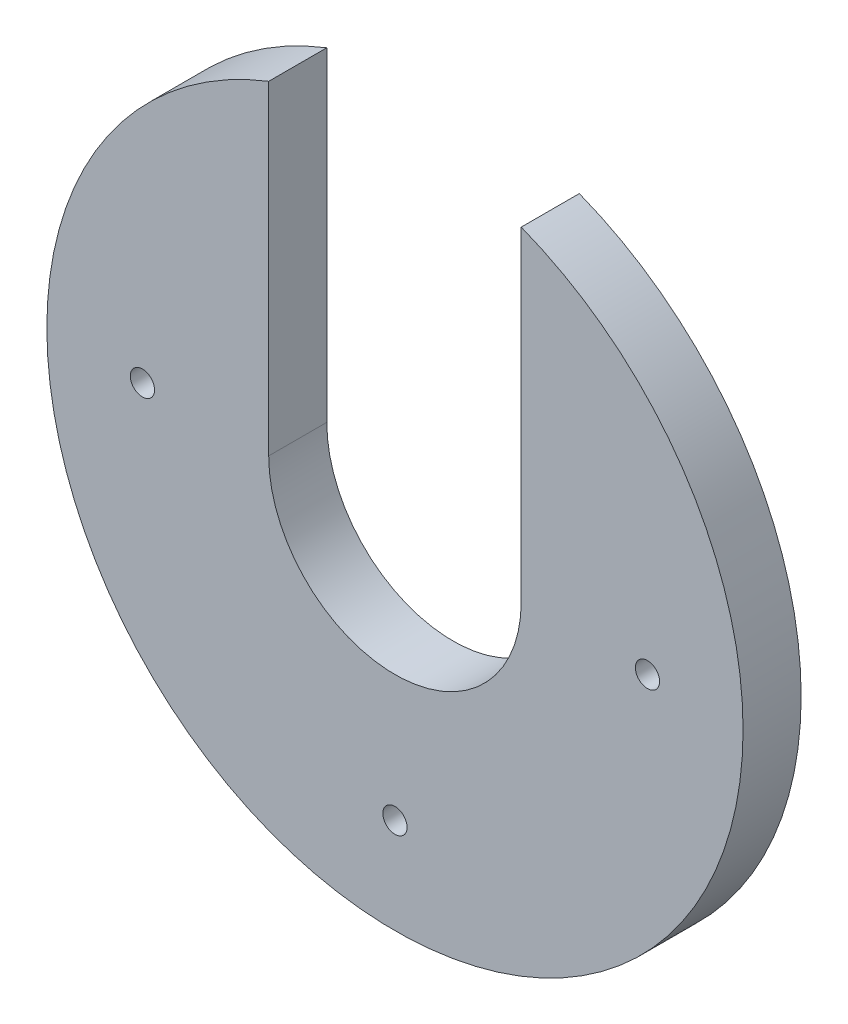
ISO-10303-21;
HEADER;
FILE_DESCRIPTION(('STEP AP214'),'2;1');
FILE_NAME('part.step','',(''),(''),'','','');
FILE_SCHEMA(('AUTOMOTIVE_DESIGN { 1 0 10303 214 1 1 1 1 }'));
ENDSEC;
DATA;
#1=APPLICATION_CONTEXT('core data for automotive mechanical design processes');
#2=APPLICATION_PROTOCOL_DEFINITION('international standard','automotive_design',2000,#1);
#3=PRODUCT_CONTEXT('',#1,'mechanical');
#4=PRODUCT('Part','Part','',(#3));
#5=PRODUCT_RELATED_PRODUCT_CATEGORY('part','',(#4));
#6=PRODUCT_DEFINITION_FORMATION('','',#4);
#7=PRODUCT_DEFINITION_CONTEXT('part definition',#1,'design');
#8=PRODUCT_DEFINITION('design','',#6,#7);
#9=PRODUCT_DEFINITION_SHAPE('','',#8);
#10=(LENGTH_UNIT() NAMED_UNIT(*) SI_UNIT(.MILLI.,.METRE.));
#11=(NAMED_UNIT(*) PLANE_ANGLE_UNIT() SI_UNIT($,.RADIAN.));
#12=(NAMED_UNIT(*) SI_UNIT($,.STERADIAN.) SOLID_ANGLE_UNIT());
#13=UNCERTAINTY_MEASURE_WITH_UNIT(LENGTH_MEASURE(1.E-05),#10,'distance_accuracy_value','');
#14=(GEOMETRIC_REPRESENTATION_CONTEXT(3) GLOBAL_UNCERTAINTY_ASSIGNED_CONTEXT((#13)) GLOBAL_UNIT_ASSIGNED_CONTEXT((#10,
#11,#12)) REPRESENTATION_CONTEXT('',''));
#15=CARTESIAN_POINT('',(0.,0.,0.));
#16=DIRECTION('',(0.,0.,1.));
#17=DIRECTION('',(1.,0.,0.));
#18=AXIS2_PLACEMENT_3D('',#15,#16,#17);
#19=CARTESIAN_POINT('',(0.,0.,5.842));
#20=DIRECTION('',(0.,0.,-1.));
#21=DIRECTION('',(-1.,0.,0.));
#22=AXIS2_PLACEMENT_3D('',#19,#20,#21);
#23=CYLINDRICAL_SURFACE('',#22,12.7);
#24=CARTESIAN_POINT('',(0.,0.,0.));
#25=DIRECTION('',(0.,0.,1.));
#26=DIRECTION('',(1.,0.,0.));
#27=AXIS2_PLACEMENT_3D('',#24,#25,#26);
#28=CIRCLE('',#27,12.7);
#29=CARTESIAN_POINT('',(-12.7,0.,0.));
#30=VERTEX_POINT('',#29);
#31=CARTESIAN_POINT('',(12.7,0.,0.));
#32=VERTEX_POINT('',#31);
#33=EDGE_CURVE('E105',#30,#32,#28,.T.);
#34=ORIENTED_EDGE('',*,*,#33,.F.);
#35=DIRECTION('',(0.,0.,-1.));
#36=VECTOR('',#35,1.);
#37=CARTESIAN_POINT('',(-12.7,0.,5.842));
#38=LINE('',#37,#36);
#39=CARTESIAN_POINT('',(-12.7,0.,5.842));
#40=VERTEX_POINT('',#39);
#41=EDGE_CURVE('E11',#40,#30,#38,.T.);
#42=ORIENTED_EDGE('',*,*,#41,.F.);
#43=CARTESIAN_POINT('',(0.,0.,5.842));
#44=DIRECTION('',(0.,0.,1.));
#45=DIRECTION('',(1.,0.,0.));
#46=AXIS2_PLACEMENT_3D('',#43,#44,#45);
#47=CIRCLE('',#46,12.7);
#48=CARTESIAN_POINT('',(12.7,0.,5.842));
#49=VERTEX_POINT('',#48);
#50=EDGE_CURVE('E89',#40,#49,#47,.T.);
#51=ORIENTED_EDGE('',*,*,#50,.T.);
#52=DIRECTION('',(0.,0.,-1.));
#53=VECTOR('',#52,1.);
#54=CARTESIAN_POINT('',(12.7,0.,5.842));
#55=LINE('',#54,#53);
#56=EDGE_CURVE('E51',#49,#32,#55,.T.);
#57=ORIENTED_EDGE('',*,*,#56,.T.);
#58=EDGE_LOOP('',(#34,#42,#51,#57));
#59=FACE_BOUND('',#58,.T.);
#60=ADVANCED_FACE('F34',(#59),#23,.F.);
#61=CARTESIAN_POINT('',(-12.7,0.,5.842));
#62=DIRECTION('',(-1.,0.,0.));
#63=DIRECTION('',(0.,0.,1.));
#64=AXIS2_PLACEMENT_3D('',#61,#62,#63);
#65=PLANE('',#64);
#66=DIRECTION('',(0.,1.,0.));
#67=VECTOR('',#66,1.);
#68=CARTESIAN_POINT('',(-12.7,0.,0.));
#69=LINE('',#68,#67);
#70=CARTESIAN_POINT('',(-12.7,32.6294834959121,0.));
#71=VERTEX_POINT('',#70);
#72=EDGE_CURVE('E94',#30,#71,#69,.T.);
#73=ORIENTED_EDGE('',*,*,#72,.T.);
#74=DIRECTION('',(0.,0.,-1.));
#75=VECTOR('',#74,1.);
#76=CARTESIAN_POINT('',(-12.7,32.6294834959121,5.842));
#77=LINE('',#76,#75);
#78=CARTESIAN_POINT('',(-12.7,32.6294834959121,5.842));
#79=VERTEX_POINT('',#78);
#80=EDGE_CURVE('E43',#79,#71,#77,.T.);
#81=ORIENTED_EDGE('',*,*,#80,.F.);
#82=DIRECTION('',(0.,1.,0.));
#83=VECTOR('',#82,1.);
#84=CARTESIAN_POINT('',(-12.7,0.,5.842));
#85=LINE('',#84,#83);
#86=EDGE_CURVE('E85',#40,#79,#85,.T.);
#87=ORIENTED_EDGE('',*,*,#86,.F.);
#88=ORIENTED_EDGE('',*,*,#41,.T.);
#89=EDGE_LOOP('',(#73,#81,#87,#88));
#90=FACE_BOUND('',#89,.T.);
#91=ADVANCED_FACE('F92',(#90),#65,.F.);
#92=CARTESIAN_POINT('',(0.,0.,5.842));
#93=DIRECTION('',(0.,0.,-1.));
#94=DIRECTION('',(-1.,0.,0.));
#95=AXIS2_PLACEMENT_3D('',#92,#93,#94);
#96=CYLINDRICAL_SURFACE('',#95,35.0139);
#97=CARTESIAN_POINT('',(0.,0.,0.));
#98=DIRECTION('',(0.,0.,1.));
#99=DIRECTION('',(1.,0.,0.));
#100=AXIS2_PLACEMENT_3D('',#97,#98,#99);
#101=CIRCLE('',#100,35.0139);
#102=CARTESIAN_POINT('',(12.7,32.6294834959121,0.));
#103=VERTEX_POINT('',#102);
#104=EDGE_CURVE('E102',#71,#103,#101,.T.);
#105=ORIENTED_EDGE('',*,*,#104,.T.);
#106=DIRECTION('',(0.,0.,-1.));
#107=VECTOR('',#106,1.);
#108=CARTESIAN_POINT('',(12.7,32.6294834959121,5.842));
#109=LINE('',#108,#107);
#110=CARTESIAN_POINT('',(12.7,32.6294834959121,5.842));
#111=VERTEX_POINT('',#110);
#112=EDGE_CURVE('E65',#111,#103,#109,.T.);
#113=ORIENTED_EDGE('',*,*,#112,.F.);
#114=CARTESIAN_POINT('',(0.,0.,5.842));
#115=DIRECTION('',(0.,0.,1.));
#116=DIRECTION('',(1.,0.,0.));
#117=AXIS2_PLACEMENT_3D('',#114,#115,#116);
#118=CIRCLE('',#117,35.0139);
#119=EDGE_CURVE('E77',#79,#111,#118,.T.);
#120=ORIENTED_EDGE('',*,*,#119,.F.);
#121=ORIENTED_EDGE('',*,*,#80,.T.);
#122=EDGE_LOOP('',(#105,#113,#120,#121));
#123=FACE_BOUND('',#122,.T.);
#124=ADVANCED_FACE('F79',(#123),#96,.T.);
#125=CARTESIAN_POINT('',(25.4,0.,5.842));
#126=DIRECTION('',(0.,0.,-1.));
#127=DIRECTION('',(-1.,0.,0.));
#128=AXIS2_PLACEMENT_3D('',#125,#126,#127);
#129=CYLINDRICAL_SURFACE('',#128,1.2192);
#130=CARTESIAN_POINT('',(25.4,0.,5.842));
#131=DIRECTION('',(0.,0.,1.));
#132=DIRECTION('',(1.,0.,0.));
#133=AXIS2_PLACEMENT_3D('',#130,#131,#132);
#134=CIRCLE('',#133,1.2192);
#135=CARTESIAN_POINT('',(26.6192,0.,5.842));
#136=VERTEX_POINT('',#135);
#137=EDGE_CURVE('E118',#136,#136,#134,.T.);
#138=ORIENTED_EDGE('',*,*,#137,.T.);
#139=EDGE_LOOP('',(#138));
#140=FACE_BOUND('',#139,.T.);
#141=CARTESIAN_POINT('',(25.4,0.,0.));
#142=DIRECTION('',(0.,0.,1.));
#143=DIRECTION('',(1.,0.,0.));
#144=AXIS2_PLACEMENT_3D('',#141,#142,#143);
#145=CIRCLE('',#144,1.2192);
#146=CARTESIAN_POINT('',(26.6192,0.,0.));
#147=VERTEX_POINT('',#146);
#148=EDGE_CURVE('E107',#147,#147,#145,.T.);
#149=ORIENTED_EDGE('',*,*,#148,.F.);
#150=EDGE_LOOP('',(#149));
#151=FACE_BOUND('',#150,.T.);
#152=ADVANCED_FACE('F138',(#140,#151),#129,.F.);
#153=CARTESIAN_POINT('',(0.,-25.4,5.842));
#154=DIRECTION('',(0.,0.,-1.));
#155=DIRECTION('',(-1.,0.,0.));
#156=AXIS2_PLACEMENT_3D('',#153,#154,#155);
#157=CYLINDRICAL_SURFACE('',#156,1.2192);
#158=CARTESIAN_POINT('',(0.,-25.4,5.842));
#159=DIRECTION('',(0.,0.,1.));
#160=DIRECTION('',(1.,0.,0.));
#161=AXIS2_PLACEMENT_3D('',#158,#159,#160);
#162=CIRCLE('',#161,1.2192);
#163=CARTESIAN_POINT('',(1.2192,-25.4,5.842));
#164=VERTEX_POINT('',#163);
#165=EDGE_CURVE('E121',#164,#164,#162,.T.);
#166=ORIENTED_EDGE('',*,*,#165,.T.);
#167=EDGE_LOOP('',(#166));
#168=FACE_BOUND('',#167,.T.);
#169=CARTESIAN_POINT('',(0.,-25.4,0.));
#170=DIRECTION('',(0.,0.,1.));
#171=DIRECTION('',(1.,0.,0.));
#172=AXIS2_PLACEMENT_3D('',#169,#170,#171);
#173=CIRCLE('',#172,1.2192);
#174=CARTESIAN_POINT('',(1.2192,-25.4,0.));
#175=VERTEX_POINT('',#174);
#176=EDGE_CURVE('E110',#175,#175,#173,.T.);
#177=ORIENTED_EDGE('',*,*,#176,.F.);
#178=EDGE_LOOP('',(#177));
#179=FACE_BOUND('',#178,.T.);
#180=ADVANCED_FACE('F141',(#168,#179),#157,.F.);
#181=CARTESIAN_POINT('',(-25.4,0.,5.842));
#182=DIRECTION('',(0.,0.,-1.));
#183=DIRECTION('',(-1.,0.,0.));
#184=AXIS2_PLACEMENT_3D('',#181,#182,#183);
#185=CYLINDRICAL_SURFACE('',#184,1.2192);
#186=CARTESIAN_POINT('',(-25.4,0.,5.842));
#187=DIRECTION('',(0.,0.,1.));
#188=DIRECTION('',(1.,0.,0.));
#189=AXIS2_PLACEMENT_3D('',#186,#187,#188);
#190=CIRCLE('',#189,1.2192);
#191=CARTESIAN_POINT('',(-24.1808,0.,5.842));
#192=VERTEX_POINT('',#191);
#193=EDGE_CURVE('E101',#192,#192,#190,.T.);
#194=ORIENTED_EDGE('',*,*,#193,.T.);
#195=EDGE_LOOP('',(#194));
#196=FACE_BOUND('',#195,.T.);
#197=CARTESIAN_POINT('',(-25.4,0.,0.));
#198=DIRECTION('',(0.,0.,1.));
#199=DIRECTION('',(1.,0.,0.));
#200=AXIS2_PLACEMENT_3D('',#197,#198,#199);
#201=CIRCLE('',#200,1.2192);
#202=CARTESIAN_POINT('',(-24.1808,0.,0.));
#203=VERTEX_POINT('',#202);
#204=EDGE_CURVE('E113',#203,#203,#201,.T.);
#205=ORIENTED_EDGE('',*,*,#204,.F.);
#206=EDGE_LOOP('',(#205));
#207=FACE_BOUND('',#206,.T.);
#208=ADVANCED_FACE('F36',(#196,#207),#185,.F.);
#209=CARTESIAN_POINT('',(12.7,0.,5.842));
#210=DIRECTION('',(-1.,0.,0.));
#211=DIRECTION('',(0.,0.,1.));
#212=AXIS2_PLACEMENT_3D('',#209,#210,#211);
#213=PLANE('',#212);
#214=DIRECTION('',(0.,1.,0.));
#215=VECTOR('',#214,1.);
#216=CARTESIAN_POINT('',(12.7,0.,0.));
#217=LINE('',#216,#215);
#218=EDGE_CURVE('E98',#32,#103,#217,.T.);
#219=ORIENTED_EDGE('',*,*,#218,.F.);
#220=ORIENTED_EDGE('',*,*,#56,.F.);
#221=DIRECTION('',(0.,1.,0.));
#222=VECTOR('',#221,1.);
#223=CARTESIAN_POINT('',(12.7,0.,5.842));
#224=LINE('',#223,#222);
#225=EDGE_CURVE('E84',#49,#111,#224,.T.);
#226=ORIENTED_EDGE('',*,*,#225,.T.);
#227=ORIENTED_EDGE('',*,*,#112,.T.);
#228=EDGE_LOOP('',(#219,#220,#226,#227));
#229=FACE_BOUND('',#228,.T.);
#230=ADVANCED_FACE('F132',(#229),#213,.T.);
#231=CARTESIAN_POINT('',(0.,0.,5.842));
#232=DIRECTION('',(0.,0.,1.));
#233=DIRECTION('',(1.,0.,0.));
#234=AXIS2_PLACEMENT_3D('',#231,#232,#233);
#235=PLANE('',#234);
#236=ORIENTED_EDGE('',*,*,#193,.F.);
#237=EDGE_LOOP('',(#236));
#238=FACE_BOUND('',#237,.T.);
#239=ORIENTED_EDGE('',*,*,#165,.F.);
#240=EDGE_LOOP('',(#239));
#241=FACE_BOUND('',#240,.T.);
#242=ORIENTED_EDGE('',*,*,#137,.F.);
#243=EDGE_LOOP('',(#242));
#244=FACE_BOUND('',#243,.T.);
#245=ORIENTED_EDGE('',*,*,#50,.F.);
#246=ORIENTED_EDGE('',*,*,#86,.T.);
#247=ORIENTED_EDGE('',*,*,#119,.T.);
#248=ORIENTED_EDGE('',*,*,#225,.F.);
#249=EDGE_LOOP('',(#245,#246,#247,#248));
#250=FACE_BOUND('',#249,.T.);
#251=ADVANCED_FACE('F88',(#238,#241,#244,#250),#235,.T.);
#252=CARTESIAN_POINT('',(0.,0.,0.));
#253=DIRECTION('',(0.,0.,1.));
#254=DIRECTION('',(1.,0.,0.));
#255=AXIS2_PLACEMENT_3D('',#252,#253,#254);
#256=PLANE('',#255);
#257=ORIENTED_EDGE('',*,*,#204,.T.);
#258=EDGE_LOOP('',(#257));
#259=FACE_BOUND('',#258,.T.);
#260=ORIENTED_EDGE('',*,*,#176,.T.);
#261=EDGE_LOOP('',(#260));
#262=FACE_BOUND('',#261,.T.);
#263=ORIENTED_EDGE('',*,*,#148,.T.);
#264=EDGE_LOOP('',(#263));
#265=FACE_BOUND('',#264,.T.);
#266=ORIENTED_EDGE('',*,*,#33,.T.);
#267=ORIENTED_EDGE('',*,*,#218,.T.);
#268=ORIENTED_EDGE('',*,*,#104,.F.);
#269=ORIENTED_EDGE('',*,*,#72,.F.);
#270=EDGE_LOOP('',(#266,#267,#268,#269));
#271=FACE_BOUND('',#270,.T.);
#272=ADVANCED_FACE('F131',(#259,#262,#265,#271),#256,.F.);
#273=CLOSED_SHELL('',(#60,#91,#124,#152,#180,#208,#230,#251,#272));
#274=MANIFOLD_SOLID_BREP('B2',#273);
#275=ADVANCED_BREP_SHAPE_REPRESENTATION('',(#18,#274),#14);
#276=SHAPE_DEFINITION_REPRESENTATION(#9,#275);
ENDSEC;
END-ISO-10303-21;
